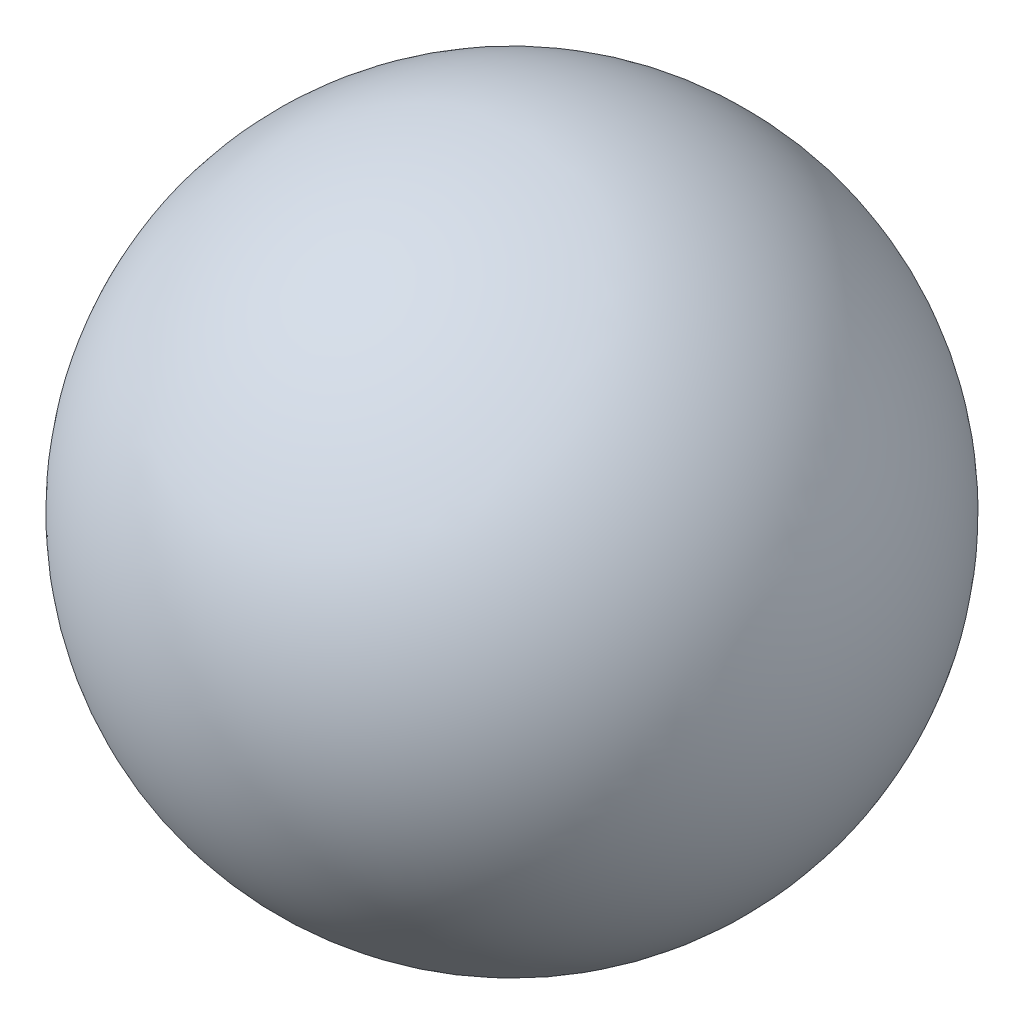
ISO-10303-21;
HEADER;
FILE_DESCRIPTION(('STEP AP214'),'2;1');
FILE_NAME('part.step','',(''),(''),'','','');
FILE_SCHEMA(('AUTOMOTIVE_DESIGN { 1 0 10303 214 1 1 1 1 }'));
ENDSEC;
DATA;
#1=APPLICATION_CONTEXT('core data for automotive mechanical design processes');
#2=APPLICATION_PROTOCOL_DEFINITION('international standard','automotive_design',2000,#1);
#3=PRODUCT_CONTEXT('',#1,'mechanical');
#4=PRODUCT('Part','Part','',(#3));
#5=PRODUCT_RELATED_PRODUCT_CATEGORY('part','',(#4));
#6=PRODUCT_DEFINITION_FORMATION('','',#4);
#7=PRODUCT_DEFINITION_CONTEXT('part definition',#1,'design');
#8=PRODUCT_DEFINITION('design','',#6,#7);
#9=PRODUCT_DEFINITION_SHAPE('','',#8);
#10=(LENGTH_UNIT() NAMED_UNIT(*) SI_UNIT(.MILLI.,.METRE.));
#11=(NAMED_UNIT(*) PLANE_ANGLE_UNIT() SI_UNIT($,.RADIAN.));
#12=(NAMED_UNIT(*) SI_UNIT($,.STERADIAN.) SOLID_ANGLE_UNIT());
#13=UNCERTAINTY_MEASURE_WITH_UNIT(LENGTH_MEASURE(1.E-05),#10,'distance_accuracy_value','');
#14=(GEOMETRIC_REPRESENTATION_CONTEXT(3) GLOBAL_UNCERTAINTY_ASSIGNED_CONTEXT((#13)) GLOBAL_UNIT_ASSIGNED_CONTEXT((#10,
#11,#12)) REPRESENTATION_CONTEXT('',''));
#15=CARTESIAN_POINT('',(0.,0.,0.));
#16=DIRECTION('',(0.,0.,1.));
#17=DIRECTION('',(1.,0.,0.));
#18=AXIS2_PLACEMENT_3D('',#15,#16,#17);
#19=CARTESIAN_POINT('',(7.,0.,0.));
#20=DIRECTION('',(-1.,0.,0.));
#21=DIRECTION('',(0.,1.,0.));
#22=AXIS2_PLACEMENT_3D('',#19,#20,#21);
#23=SPHERICAL_SURFACE('',#22,7.);
#24=CARTESIAN_POINT('',(0.,0.,0.));
#25=VERTEX_POINT('',#24);
#26=VERTEX_LOOP('',#25);
#27=FACE_BOUND('',#26,.T.);
#28=ADVANCED_FACE('F29',(#27),#23,.T.);
#29=CLOSED_SHELL('',(#28));
#30=MANIFOLD_SOLID_BREP('B2',#29);
#31=ADVANCED_BREP_SHAPE_REPRESENTATION('',(#18,#30),#14);
#32=SHAPE_DEFINITION_REPRESENTATION(#9,#31);
ENDSEC;
END-ISO-10303-21;
